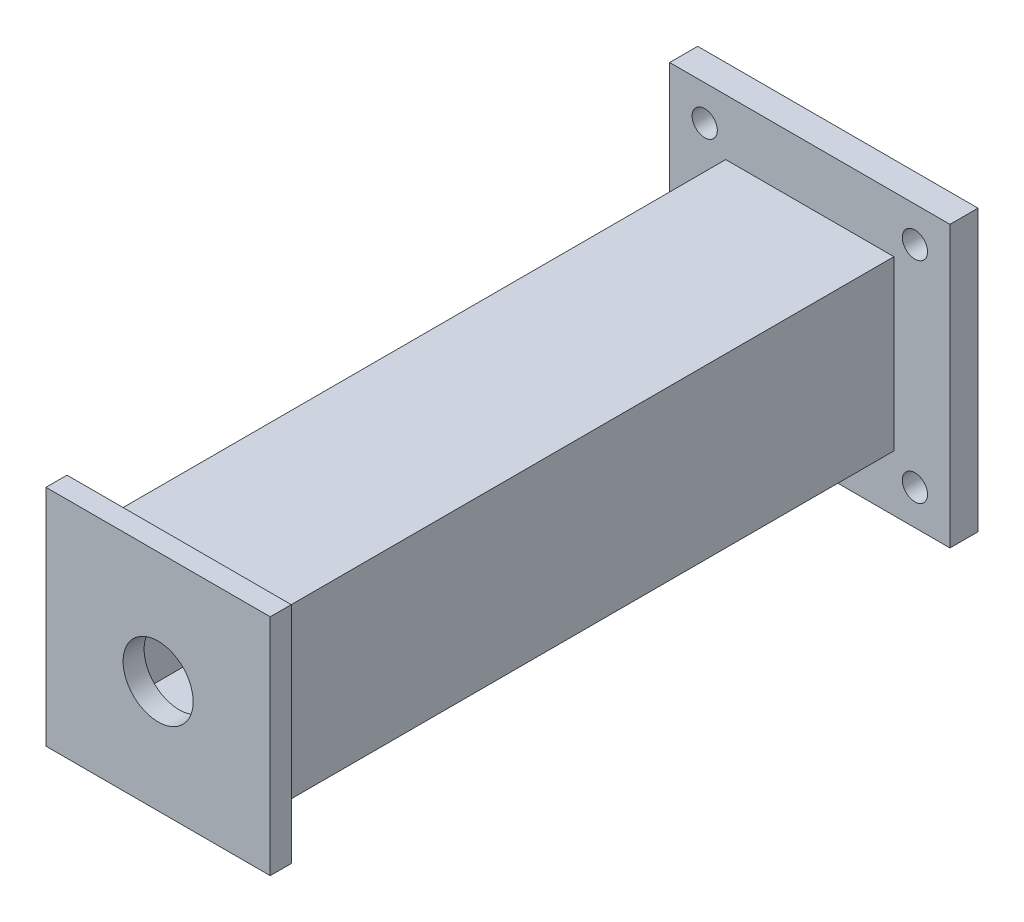
ISO-10303-21;
HEADER;
FILE_DESCRIPTION(('STEP AP214'),'2;1');
FILE_NAME('part.step','',(''),(''),'','','');
FILE_SCHEMA(('AUTOMOTIVE_DESIGN { 1 0 10303 214 1 1 1 1 }'));
ENDSEC;
DATA;
#1=APPLICATION_CONTEXT('core data for automotive mechanical design processes');
#2=APPLICATION_PROTOCOL_DEFINITION('international standard','automotive_design',2000,#1);
#3=PRODUCT_CONTEXT('',#1,'mechanical');
#4=PRODUCT('Part','Part','',(#3));
#5=PRODUCT_RELATED_PRODUCT_CATEGORY('part','',(#4));
#6=PRODUCT_DEFINITION_FORMATION('','',#4);
#7=PRODUCT_DEFINITION_CONTEXT('part definition',#1,'design');
#8=PRODUCT_DEFINITION('design','',#6,#7);
#9=PRODUCT_DEFINITION_SHAPE('','',#8);
#10=(LENGTH_UNIT() NAMED_UNIT(*) SI_UNIT(.MILLI.,.METRE.));
#11=(NAMED_UNIT(*) PLANE_ANGLE_UNIT() SI_UNIT($,.RADIAN.));
#12=(NAMED_UNIT(*) SI_UNIT($,.STERADIAN.) SOLID_ANGLE_UNIT());
#13=UNCERTAINTY_MEASURE_WITH_UNIT(LENGTH_MEASURE(1.E-05),#10,'distance_accuracy_value','');
#14=(GEOMETRIC_REPRESENTATION_CONTEXT(3) GLOBAL_UNCERTAINTY_ASSIGNED_CONTEXT((#13)) GLOBAL_UNIT_ASSIGNED_CONTEXT((#10,
#11,#12)) REPRESENTATION_CONTEXT('',''));
#15=CARTESIAN_POINT('',(0.,0.,0.));
#16=DIRECTION('',(0.,0.,1.));
#17=DIRECTION('',(1.,0.,0.));
#18=AXIS2_PLACEMENT_3D('',#15,#16,#17);
#19=CARTESIAN_POINT('',(-60.,60.,225.));
#20=DIRECTION('',(1.,0.,0.));
#21=DIRECTION('',(0.,0.,-1.));
#22=AXIS2_PLACEMENT_3D('',#19,#20,#21);
#23=PLANE('',#22);
#24=DIRECTION('',(0.,-1.,0.));
#25=VECTOR('',#24,1.);
#26=CARTESIAN_POINT('',(-60.,60.,-225.));
#27=LINE('',#26,#25);
#28=CARTESIAN_POINT('',(-60.,60.,-225.));
#29=VERTEX_POINT('',#28);
#30=CARTESIAN_POINT('',(-60.,-60.,-225.));
#31=VERTEX_POINT('',#30);
#32=EDGE_CURVE('E257',#29,#31,#27,.T.);
#33=ORIENTED_EDGE('',*,*,#32,.T.);
#34=DIRECTION('',(0.,0.,-1.));
#35=VECTOR('',#34,1.);
#36=CARTESIAN_POINT('',(-60.,-60.,225.));
#37=LINE('',#36,#35);
#38=CARTESIAN_POINT('',(-60.,-60.,225.));
#39=VERTEX_POINT('',#38);
#40=EDGE_CURVE('E11',#39,#31,#37,.T.);
#41=ORIENTED_EDGE('',*,*,#40,.F.);
#42=DIRECTION('',(0.,-1.,0.));
#43=VECTOR('',#42,1.);
#44=CARTESIAN_POINT('',(-60.,60.,225.));
#45=LINE('',#44,#43);
#46=CARTESIAN_POINT('',(-60.,60.,225.));
#47=VERTEX_POINT('',#46);
#48=EDGE_CURVE('E258',#47,#39,#45,.T.);
#49=ORIENTED_EDGE('',*,*,#48,.F.);
#50=DIRECTION('',(0.,0.,-1.));
#51=VECTOR('',#50,1.);
#52=CARTESIAN_POINT('',(-60.,60.,225.));
#53=LINE('',#52,#51);
#54=EDGE_CURVE('E271',#47,#29,#53,.T.);
#55=ORIENTED_EDGE('',*,*,#54,.T.);
#56=EDGE_LOOP('',(#33,#41,#49,#55));
#57=FACE_BOUND('',#56,.T.);
#58=ADVANCED_FACE('F39',(#57),#23,.F.);
#59=CARTESIAN_POINT('',(-60.,-60.,225.));
#60=DIRECTION('',(0.,1.,0.));
#61=DIRECTION('',(0.,0.,1.));
#62=AXIS2_PLACEMENT_3D('',#59,#60,#61);
#63=PLANE('',#62);
#64=DIRECTION('',(1.,0.,0.));
#65=VECTOR('',#64,1.);
#66=CARTESIAN_POINT('',(-60.,-60.,-225.));
#67=LINE('',#66,#65);
#68=CARTESIAN_POINT('',(60.,-60.,-225.));
#69=VERTEX_POINT('',#68);
#70=EDGE_CURVE('E274',#31,#69,#67,.T.);
#71=ORIENTED_EDGE('',*,*,#70,.T.);
#72=DIRECTION('',(0.,0.,-1.));
#73=VECTOR('',#72,1.);
#74=CARTESIAN_POINT('',(60.,-60.,225.));
#75=LINE('',#74,#73);
#76=CARTESIAN_POINT('',(60.,-60.,225.));
#77=VERTEX_POINT('',#76);
#78=EDGE_CURVE('E46',#77,#69,#75,.T.);
#79=ORIENTED_EDGE('',*,*,#78,.F.);
#80=DIRECTION('',(1.,0.,0.));
#81=VECTOR('',#80,1.);
#82=CARTESIAN_POINT('',(-60.,-60.,225.));
#83=LINE('',#82,#81);
#84=EDGE_CURVE('E261',#39,#77,#83,.T.);
#85=ORIENTED_EDGE('',*,*,#84,.F.);
#86=ORIENTED_EDGE('',*,*,#40,.T.);
#87=EDGE_LOOP('',(#71,#79,#85,#86));
#88=FACE_BOUND('',#87,.T.);
#89=ADVANCED_FACE('F284',(#88),#63,.F.);
#90=CARTESIAN_POINT('',(60.,60.,225.));
#91=DIRECTION('',(-1.,0.,0.));
#92=DIRECTION('',(0.,0.,1.));
#93=AXIS2_PLACEMENT_3D('',#90,#91,#92);
#94=PLANE('',#93);
#95=DIRECTION('',(0.,1.,0.));
#96=VECTOR('',#95,1.);
#97=CARTESIAN_POINT('',(60.,60.,-225.));
#98=LINE('',#97,#96);
#99=CARTESIAN_POINT('',(60.,60.,-225.));
#100=VERTEX_POINT('',#99);
#101=EDGE_CURVE('E74',#69,#100,#98,.T.);
#102=ORIENTED_EDGE('',*,*,#101,.T.);
#103=DIRECTION('',(0.,0.,-1.));
#104=VECTOR('',#103,1.);
#105=CARTESIAN_POINT('',(60.,60.,225.));
#106=LINE('',#105,#104);
#107=CARTESIAN_POINT('',(60.,60.,225.));
#108=VERTEX_POINT('',#107);
#109=EDGE_CURVE('E62',#108,#100,#106,.T.);
#110=ORIENTED_EDGE('',*,*,#109,.F.);
#111=DIRECTION('',(0.,1.,0.));
#112=VECTOR('',#111,1.);
#113=CARTESIAN_POINT('',(60.,60.,225.));
#114=LINE('',#113,#112);
#115=EDGE_CURVE('E265',#77,#108,#114,.T.);
#116=ORIENTED_EDGE('',*,*,#115,.F.);
#117=ORIENTED_EDGE('',*,*,#78,.T.);
#118=EDGE_LOOP('',(#102,#110,#116,#117));
#119=FACE_BOUND('',#118,.T.);
#120=ADVANCED_FACE('F282',(#119),#94,.F.);
#121=CARTESIAN_POINT('',(-60.,60.,225.));
#122=DIRECTION('',(0.,-1.,0.));
#123=DIRECTION('',(0.,0.,-1.));
#124=AXIS2_PLACEMENT_3D('',#121,#122,#123);
#125=PLANE('',#124);
#126=DIRECTION('',(-1.,0.,0.));
#127=VECTOR('',#126,1.);
#128=CARTESIAN_POINT('',(-60.,60.,-225.));
#129=LINE('',#128,#127);
#130=EDGE_CURVE('E262',#100,#29,#129,.T.);
#131=ORIENTED_EDGE('',*,*,#130,.T.);
#132=ORIENTED_EDGE('',*,*,#54,.F.);
#133=DIRECTION('',(-1.,0.,0.));
#134=VECTOR('',#133,1.);
#135=CARTESIAN_POINT('',(-60.,60.,225.));
#136=LINE('',#135,#134);
#137=EDGE_CURVE('E268',#108,#47,#136,.T.);
#138=ORIENTED_EDGE('',*,*,#137,.F.);
#139=ORIENTED_EDGE('',*,*,#109,.T.);
#140=EDGE_LOOP('',(#131,#132,#138,#139));
#141=FACE_BOUND('',#140,.T.);
#142=ADVANCED_FACE('F291',(#141),#125,.F.);
#143=CARTESIAN_POINT('',(-50.,50.,225.));
#144=DIRECTION('',(1.,0.,0.));
#145=DIRECTION('',(0.,0.,-1.));
#146=AXIS2_PLACEMENT_3D('',#143,#144,#145);
#147=PLANE('',#146);
#148=DIRECTION('',(0.,-1.,0.));
#149=VECTOR('',#148,1.);
#150=CARTESIAN_POINT('',(-50.,50.,-225.));
#151=LINE('',#150,#149);
#152=CARTESIAN_POINT('',(-50.,50.,-225.));
#153=VERTEX_POINT('',#152);
#154=CARTESIAN_POINT('',(-50.,-50.,-225.));
#155=VERTEX_POINT('',#154);
#156=EDGE_CURVE('E228',#153,#155,#151,.T.);
#157=ORIENTED_EDGE('',*,*,#156,.F.);
#158=DIRECTION('',(0.,0.,-1.));
#159=VECTOR('',#158,1.);
#160=CARTESIAN_POINT('',(-50.,50.,225.));
#161=LINE('',#160,#159);
#162=CARTESIAN_POINT('',(-50.,50.,225.));
#163=VERTEX_POINT('',#162);
#164=EDGE_CURVE('E239',#163,#153,#161,.T.);
#165=ORIENTED_EDGE('',*,*,#164,.F.);
#166=DIRECTION('',(0.,-1.,0.));
#167=VECTOR('',#166,1.);
#168=CARTESIAN_POINT('',(-50.,50.,225.));
#169=LINE('',#168,#167);
#170=CARTESIAN_POINT('',(-50.,-50.,225.));
#171=VERTEX_POINT('',#170);
#172=EDGE_CURVE('E229',#163,#171,#169,.T.);
#173=ORIENTED_EDGE('',*,*,#172,.T.);
#174=DIRECTION('',(0.,0.,-1.));
#175=VECTOR('',#174,1.);
#176=CARTESIAN_POINT('',(-50.,-50.,225.));
#177=LINE('',#176,#175);
#178=EDGE_CURVE('E254',#171,#155,#177,.T.);
#179=ORIENTED_EDGE('',*,*,#178,.T.);
#180=EDGE_LOOP('',(#157,#165,#173,#179));
#181=FACE_BOUND('',#180,.T.);
#182=ADVANCED_FACE('F325',(#181),#147,.T.);
#183=CARTESIAN_POINT('',(-50.,-50.,225.));
#184=DIRECTION('',(0.,1.,0.));
#185=DIRECTION('',(0.,0.,1.));
#186=AXIS2_PLACEMENT_3D('',#183,#184,#185);
#187=PLANE('',#186);
#188=DIRECTION('',(1.,0.,0.));
#189=VECTOR('',#188,1.);
#190=CARTESIAN_POINT('',(-50.,-50.,-225.));
#191=LINE('',#190,#189);
#192=CARTESIAN_POINT('',(50.,-50.,-225.));
#193=VERTEX_POINT('',#192);
#194=EDGE_CURVE('E242',#155,#193,#191,.T.);
#195=ORIENTED_EDGE('',*,*,#194,.F.);
#196=ORIENTED_EDGE('',*,*,#178,.F.);
#197=DIRECTION('',(1.,0.,0.));
#198=VECTOR('',#197,1.);
#199=CARTESIAN_POINT('',(-50.,-50.,225.));
#200=LINE('',#199,#198);
#201=CARTESIAN_POINT('',(50.,-50.,225.));
#202=VERTEX_POINT('',#201);
#203=EDGE_CURVE('E232',#171,#202,#200,.T.);
#204=ORIENTED_EDGE('',*,*,#203,.T.);
#205=DIRECTION('',(0.,0.,-1.));
#206=VECTOR('',#205,1.);
#207=CARTESIAN_POINT('',(50.,-50.,225.));
#208=LINE('',#207,#206);
#209=EDGE_CURVE('E252',#202,#193,#208,.T.);
#210=ORIENTED_EDGE('',*,*,#209,.T.);
#211=EDGE_LOOP('',(#195,#196,#204,#210));
#212=FACE_BOUND('',#211,.T.);
#213=ADVANCED_FACE('F328',(#212),#187,.T.);
#214=CARTESIAN_POINT('',(50.,50.,225.));
#215=DIRECTION('',(-1.,0.,0.));
#216=DIRECTION('',(0.,0.,1.));
#217=AXIS2_PLACEMENT_3D('',#214,#215,#216);
#218=PLANE('',#217);
#219=DIRECTION('',(0.,1.,0.));
#220=VECTOR('',#219,1.);
#221=CARTESIAN_POINT('',(50.,50.,-225.));
#222=LINE('',#221,#220);
#223=CARTESIAN_POINT('',(50.,50.,-225.));
#224=VERTEX_POINT('',#223);
#225=EDGE_CURVE('E245',#193,#224,#222,.T.);
#226=ORIENTED_EDGE('',*,*,#225,.F.);
#227=ORIENTED_EDGE('',*,*,#209,.F.);
#228=DIRECTION('',(0.,1.,0.));
#229=VECTOR('',#228,1.);
#230=CARTESIAN_POINT('',(50.,50.,225.));
#231=LINE('',#230,#229);
#232=CARTESIAN_POINT('',(50.,50.,225.));
#233=VERTEX_POINT('',#232);
#234=EDGE_CURVE('E236',#202,#233,#231,.T.);
#235=ORIENTED_EDGE('',*,*,#234,.T.);
#236=DIRECTION('',(0.,0.,-1.));
#237=VECTOR('',#236,1.);
#238=CARTESIAN_POINT('',(50.,50.,225.));
#239=LINE('',#238,#237);
#240=EDGE_CURVE('E83',#233,#224,#239,.T.);
#241=ORIENTED_EDGE('',*,*,#240,.T.);
#242=EDGE_LOOP('',(#226,#227,#235,#241));
#243=FACE_BOUND('',#242,.T.);
#244=ADVANCED_FACE('F306',(#243),#218,.T.);
#245=CARTESIAN_POINT('',(-50.,50.,225.));
#246=DIRECTION('',(0.,-1.,0.));
#247=DIRECTION('',(0.,0.,-1.));
#248=AXIS2_PLACEMENT_3D('',#245,#246,#247);
#249=PLANE('',#248);
#250=DIRECTION('',(-1.,0.,0.));
#251=VECTOR('',#250,1.);
#252=CARTESIAN_POINT('',(-50.,50.,-225.));
#253=LINE('',#252,#251);
#254=EDGE_CURVE('E233',#224,#153,#253,.T.);
#255=ORIENTED_EDGE('',*,*,#254,.F.);
#256=ORIENTED_EDGE('',*,*,#240,.F.);
#257=DIRECTION('',(-1.,0.,0.));
#258=VECTOR('',#257,1.);
#259=CARTESIAN_POINT('',(-50.,50.,225.));
#260=LINE('',#259,#258);
#261=EDGE_CURVE('E53',#233,#163,#260,.T.);
#262=ORIENTED_EDGE('',*,*,#261,.T.);
#263=ORIENTED_EDGE('',*,*,#164,.T.);
#264=EDGE_LOOP('',(#255,#256,#262,#263));
#265=FACE_BOUND('',#264,.T.);
#266=ADVANCED_FACE('F296',(#265),#249,.T.);
#267=CARTESIAN_POINT('',(0.,0.,225.));
#268=DIRECTION('',(0.,0.,1.));
#269=DIRECTION('',(1.,0.,0.));
#270=AXIS2_PLACEMENT_3D('',#267,#268,#269);
#271=PLANE('',#270);
#272=DIRECTION('',(0.,-1.,0.));
#273=VECTOR('',#272,1.);
#274=CARTESIAN_POINT('',(-80.,80.,225.));
#275=LINE('',#274,#273);
#276=CARTESIAN_POINT('',(-80.,80.,225.));
#277=VERTEX_POINT('',#276);
#278=CARTESIAN_POINT('',(-80.,-80.,225.));
#279=VERTEX_POINT('',#278);
#280=EDGE_CURVE('E197',#277,#279,#275,.T.);
#281=ORIENTED_EDGE('',*,*,#280,.F.);
#282=DIRECTION('',(-1.,0.,0.));
#283=VECTOR('',#282,1.);
#284=CARTESIAN_POINT('',(-80.,80.,225.));
#285=LINE('',#284,#283);
#286=CARTESIAN_POINT('',(80.,80.,225.));
#287=VERTEX_POINT('',#286);
#288=EDGE_CURVE('E203',#287,#277,#285,.T.);
#289=ORIENTED_EDGE('',*,*,#288,.F.);
#290=DIRECTION('',(0.,1.,0.));
#291=VECTOR('',#290,1.);
#292=CARTESIAN_POINT('',(80.,80.,225.));
#293=LINE('',#292,#291);
#294=CARTESIAN_POINT('',(80.,-80.,225.));
#295=VERTEX_POINT('',#294);
#296=EDGE_CURVE('E214',#295,#287,#293,.T.);
#297=ORIENTED_EDGE('',*,*,#296,.F.);
#298=DIRECTION('',(1.,0.,0.));
#299=VECTOR('',#298,1.);
#300=CARTESIAN_POINT('',(-80.,-80.,225.));
#301=LINE('',#300,#299);
#302=EDGE_CURVE('E212',#279,#295,#301,.T.);
#303=ORIENTED_EDGE('',*,*,#302,.F.);
#304=EDGE_LOOP('',(#281,#289,#297,#303));
#305=FACE_BOUND('',#304,.T.);
#306=ORIENTED_EDGE('',*,*,#137,.T.);
#307=ORIENTED_EDGE('',*,*,#48,.T.);
#308=ORIENTED_EDGE('',*,*,#84,.T.);
#309=ORIENTED_EDGE('',*,*,#115,.T.);
#310=EDGE_LOOP('',(#306,#307,#308,#309));
#311=FACE_BOUND('',#310,.T.);
#312=ADVANCED_FACE('F293',(#305,#311),#271,.F.);
#313=CARTESIAN_POINT('',(0.,0.,240.));
#314=DIRECTION('',(0.,0.,1.));
#315=DIRECTION('',(1.,0.,0.));
#316=AXIS2_PLACEMENT_3D('',#313,#314,#315);
#317=PLANE('',#316);
#318=DIRECTION('',(0.,-1.,0.));
#319=VECTOR('',#318,1.);
#320=CARTESIAN_POINT('',(-80.,80.,240.));
#321=LINE('',#320,#319);
#322=CARTESIAN_POINT('',(-80.,80.,240.));
#323=VERTEX_POINT('',#322);
#324=CARTESIAN_POINT('',(-80.,-80.,240.));
#325=VERTEX_POINT('',#324);
#326=EDGE_CURVE('E199',#323,#325,#321,.T.);
#327=ORIENTED_EDGE('',*,*,#326,.T.);
#328=DIRECTION('',(1.,0.,0.));
#329=VECTOR('',#328,1.);
#330=CARTESIAN_POINT('',(-80.,-80.,240.));
#331=LINE('',#330,#329);
#332=CARTESIAN_POINT('',(80.,-80.,240.));
#333=VERTEX_POINT('',#332);
#334=EDGE_CURVE('E202',#325,#333,#331,.T.);
#335=ORIENTED_EDGE('',*,*,#334,.T.);
#336=DIRECTION('',(0.,1.,0.));
#337=VECTOR('',#336,1.);
#338=CARTESIAN_POINT('',(80.,80.,240.));
#339=LINE('',#338,#337);
#340=CARTESIAN_POINT('',(80.,80.,240.));
#341=VERTEX_POINT('',#340);
#342=EDGE_CURVE('E205',#333,#341,#339,.T.);
#343=ORIENTED_EDGE('',*,*,#342,.T.);
#344=DIRECTION('',(-1.,0.,0.));
#345=VECTOR('',#344,1.);
#346=CARTESIAN_POINT('',(-80.,80.,240.));
#347=LINE('',#346,#345);
#348=EDGE_CURVE('E207',#341,#323,#347,.T.);
#349=ORIENTED_EDGE('',*,*,#348,.T.);
#350=EDGE_LOOP('',(#327,#335,#343,#349));
#351=FACE_BOUND('',#350,.T.);
#352=CARTESIAN_POINT('',(0.,0.,240.));
#353=DIRECTION('',(0.,0.,1.));
#354=DIRECTION('',(1.,0.,0.));
#355=AXIS2_PLACEMENT_3D('',#352,#353,#354);
#356=CIRCLE('',#355,25.);
#357=CARTESIAN_POINT('',(25.,0.,240.));
#358=VERTEX_POINT('',#357);
#359=EDGE_CURVE('E190',#358,#358,#356,.T.);
#360=ORIENTED_EDGE('',*,*,#359,.F.);
#361=EDGE_LOOP('',(#360));
#362=FACE_BOUND('',#361,.T.);
#363=ADVANCED_FACE('F295',(#351,#362),#317,.T.);
#364=ORIENTED_EDGE('',*,*,#203,.F.);
#365=ORIENTED_EDGE('',*,*,#172,.F.);
#366=ORIENTED_EDGE('',*,*,#261,.F.);
#367=ORIENTED_EDGE('',*,*,#234,.F.);
#368=EDGE_LOOP('',(#364,#365,#366,#367));
#369=FACE_BOUND('',#368,.T.);
#370=CARTESIAN_POINT('',(0.,0.,225.));
#371=DIRECTION('',(0.,0.,1.));
#372=DIRECTION('',(1.,0.,0.));
#373=AXIS2_PLACEMENT_3D('',#370,#371,#372);
#374=CIRCLE('',#373,25.);
#375=CARTESIAN_POINT('',(25.,0.,225.));
#376=VERTEX_POINT('',#375);
#377=EDGE_CURVE('E187',#376,#376,#374,.T.);
#378=ORIENTED_EDGE('',*,*,#377,.T.);
#379=EDGE_LOOP('',(#378));
#380=FACE_BOUND('',#379,.T.);
#381=ADVANCED_FACE('F299',(#369,#380),#271,.F.);
#382=CARTESIAN_POINT('',(-80.,80.,240.));
#383=DIRECTION('',(1.,0.,0.));
#384=DIRECTION('',(0.,0.,-1.));
#385=AXIS2_PLACEMENT_3D('',#382,#383,#384);
#386=PLANE('',#385);
#387=ORIENTED_EDGE('',*,*,#280,.T.);
#388=DIRECTION('',(0.,0.,-1.));
#389=VECTOR('',#388,1.);
#390=CARTESIAN_POINT('',(-80.,-80.,240.));
#391=LINE('',#390,#389);
#392=EDGE_CURVE('E225',#325,#279,#391,.T.);
#393=ORIENTED_EDGE('',*,*,#392,.F.);
#394=ORIENTED_EDGE('',*,*,#326,.F.);
#395=DIRECTION('',(0.,0.,-1.));
#396=VECTOR('',#395,1.);
#397=CARTESIAN_POINT('',(-80.,80.,240.));
#398=LINE('',#397,#396);
#399=EDGE_CURVE('E209',#323,#277,#398,.T.);
#400=ORIENTED_EDGE('',*,*,#399,.T.);
#401=EDGE_LOOP('',(#387,#393,#394,#400));
#402=FACE_BOUND('',#401,.T.);
#403=ADVANCED_FACE('F312',(#402),#386,.F.);
#404=CARTESIAN_POINT('',(-80.,-80.,240.));
#405=DIRECTION('',(0.,1.,0.));
#406=DIRECTION('',(0.,0.,1.));
#407=AXIS2_PLACEMENT_3D('',#404,#405,#406);
#408=PLANE('',#407);
#409=ORIENTED_EDGE('',*,*,#302,.T.);
#410=DIRECTION('',(0.,0.,-1.));
#411=VECTOR('',#410,1.);
#412=CARTESIAN_POINT('',(80.,-80.,240.));
#413=LINE('',#412,#411);
#414=EDGE_CURVE('E222',#333,#295,#413,.T.);
#415=ORIENTED_EDGE('',*,*,#414,.F.);
#416=ORIENTED_EDGE('',*,*,#334,.F.);
#417=ORIENTED_EDGE('',*,*,#392,.T.);
#418=EDGE_LOOP('',(#409,#415,#416,#417));
#419=FACE_BOUND('',#418,.T.);
#420=ADVANCED_FACE('F337',(#419),#408,.F.);
#421=CARTESIAN_POINT('',(80.,80.,240.));
#422=DIRECTION('',(-1.,0.,0.));
#423=DIRECTION('',(0.,0.,1.));
#424=AXIS2_PLACEMENT_3D('',#421,#422,#423);
#425=PLANE('',#424);
#426=ORIENTED_EDGE('',*,*,#296,.T.);
#427=DIRECTION('',(0.,0.,-1.));
#428=VECTOR('',#427,1.);
#429=CARTESIAN_POINT('',(80.,80.,240.));
#430=LINE('',#429,#428);
#431=EDGE_CURVE('E219',#341,#287,#430,.T.);
#432=ORIENTED_EDGE('',*,*,#431,.F.);
#433=ORIENTED_EDGE('',*,*,#342,.F.);
#434=ORIENTED_EDGE('',*,*,#414,.T.);
#435=EDGE_LOOP('',(#426,#432,#433,#434));
#436=FACE_BOUND('',#435,.T.);
#437=ADVANCED_FACE('F341',(#436),#425,.F.);
#438=CARTESIAN_POINT('',(-80.,80.,240.));
#439=DIRECTION('',(0.,-1.,0.));
#440=DIRECTION('',(0.,0.,-1.));
#441=AXIS2_PLACEMENT_3D('',#438,#439,#440);
#442=PLANE('',#441);
#443=ORIENTED_EDGE('',*,*,#288,.T.);
#444=ORIENTED_EDGE('',*,*,#399,.F.);
#445=ORIENTED_EDGE('',*,*,#348,.F.);
#446=ORIENTED_EDGE('',*,*,#431,.T.);
#447=EDGE_LOOP('',(#443,#444,#445,#446));
#448=FACE_BOUND('',#447,.T.);
#449=ADVANCED_FACE('F344',(#448),#442,.F.);
#450=CARTESIAN_POINT('',(0.,0.,240.));
#451=DIRECTION('',(0.,0.,-1.));
#452=DIRECTION('',(-1.,0.,0.));
#453=AXIS2_PLACEMENT_3D('',#450,#451,#452);
#454=CYLINDRICAL_SURFACE('',#453,25.);
#455=ORIENTED_EDGE('',*,*,#359,.T.);
#456=EDGE_LOOP('',(#455));
#457=FACE_BOUND('',#456,.T.);
#458=ORIENTED_EDGE('',*,*,#377,.F.);
#459=EDGE_LOOP('',(#458));
#460=FACE_BOUND('',#459,.T.);
#461=ADVANCED_FACE('F347',(#457,#460),#454,.F.);
#462=CARTESIAN_POINT('',(0.,0.,-225.));
#463=DIRECTION('',(0.,0.,-1.));
#464=DIRECTION('',(-1.,0.,0.));
#465=AXIS2_PLACEMENT_3D('',#462,#463,#464);
#466=PLANE('',#465);
#467=ORIENTED_EDGE('',*,*,#254,.T.);
#468=ORIENTED_EDGE('',*,*,#156,.T.);
#469=ORIENTED_EDGE('',*,*,#194,.T.);
#470=ORIENTED_EDGE('',*,*,#225,.T.);
#471=EDGE_LOOP('',(#467,#468,#469,#470));
#472=FACE_BOUND('',#471,.T.);
#473=ADVANCED_FACE('F351',(#472),#466,.F.);
#474=CARTESIAN_POINT('',(0.,0.,-245.));
#475=DIRECTION('',(0.,0.,-1.));
#476=DIRECTION('',(-1.,0.,0.));
#477=AXIS2_PLACEMENT_3D('',#474,#475,#476);
#478=PLANE('',#477);
#479=CARTESIAN_POINT('',(-75.,-75.,-245.));
#480=DIRECTION('',(0.,0.,-1.));
#481=DIRECTION('',(-1.,0.,0.));
#482=AXIS2_PLACEMENT_3D('',#479,#480,#481);
#483=CIRCLE('',#482,8.99999999999999);
#484=CARTESIAN_POINT('',(-84.,-75.,-245.));
#485=VERTEX_POINT('',#484);
#486=EDGE_CURVE('E419',#485,#485,#483,.T.);
#487=ORIENTED_EDGE('',*,*,#486,.F.);
#488=EDGE_LOOP('',(#487));
#489=FACE_BOUND('',#488,.T.);
#490=CARTESIAN_POINT('',(-75.,75.,-245.));
#491=DIRECTION('',(0.,0.,-1.));
#492=DIRECTION('',(-1.,0.,0.));
#493=AXIS2_PLACEMENT_3D('',#490,#491,#492);
#494=CIRCLE('',#493,8.99999999999999);
#495=CARTESIAN_POINT('',(-84.,75.,-245.));
#496=VERTEX_POINT('',#495);
#497=EDGE_CURVE('E431',#496,#496,#494,.T.);
#498=ORIENTED_EDGE('',*,*,#497,.F.);
#499=EDGE_LOOP('',(#498));
#500=FACE_BOUND('',#499,.T.);
#501=DIRECTION('',(0.,-1.,0.));
#502=VECTOR('',#501,1.);
#503=CARTESIAN_POINT('',(100.,100.,-245.));
#504=LINE('',#503,#502);
#505=CARTESIAN_POINT('',(100.,100.,-245.));
#506=VERTEX_POINT('',#505);
#507=CARTESIAN_POINT('',(100.,-100.,-245.));
#508=VERTEX_POINT('',#507);
#509=EDGE_CURVE('E172',#506,#508,#504,.T.);
#510=ORIENTED_EDGE('',*,*,#509,.T.);
#511=DIRECTION('',(-1.,0.,0.));
#512=VECTOR('',#511,1.);
#513=CARTESIAN_POINT('',(100.,-100.,-245.));
#514=LINE('',#513,#512);
#515=CARTESIAN_POINT('',(-100.,-100.,-245.));
#516=VERTEX_POINT('',#515);
#517=EDGE_CURVE('E161',#508,#516,#514,.T.);
#518=ORIENTED_EDGE('',*,*,#517,.T.);
#519=DIRECTION('',(0.,1.,0.));
#520=VECTOR('',#519,1.);
#521=CARTESIAN_POINT('',(-100.,100.,-245.));
#522=LINE('',#521,#520);
#523=CARTESIAN_POINT('',(-100.,100.,-245.));
#524=VERTEX_POINT('',#523);
#525=EDGE_CURVE('E171',#516,#524,#522,.T.);
#526=ORIENTED_EDGE('',*,*,#525,.T.);
#527=DIRECTION('',(1.,0.,0.));
#528=VECTOR('',#527,1.);
#529=CARTESIAN_POINT('',(100.,100.,-245.));
#530=LINE('',#529,#528);
#531=EDGE_CURVE('E178',#524,#506,#530,.T.);
#532=ORIENTED_EDGE('',*,*,#531,.T.);
#533=EDGE_LOOP('',(#510,#518,#526,#532));
#534=FACE_BOUND('',#533,.T.);
#535=CARTESIAN_POINT('',(75.,75.,-245.));
#536=DIRECTION('',(0.,0.,-1.));
#537=DIRECTION('',(-1.,0.,0.));
#538=AXIS2_PLACEMENT_3D('',#535,#536,#537);
#539=CIRCLE('',#538,8.99999999999999);
#540=CARTESIAN_POINT('',(66.,75.,-245.));
#541=VERTEX_POINT('',#540);
#542=EDGE_CURVE('E425',#541,#541,#539,.T.);
#543=ORIENTED_EDGE('',*,*,#542,.F.);
#544=EDGE_LOOP('',(#543));
#545=FACE_BOUND('',#544,.T.);
#546=CARTESIAN_POINT('',(75.,-75.,-245.));
#547=DIRECTION('',(0.,0.,-1.));
#548=DIRECTION('',(-1.,0.,0.));
#549=AXIS2_PLACEMENT_3D('',#546,#547,#548);
#550=CIRCLE('',#549,8.99999999999999);
#551=CARTESIAN_POINT('',(66.,-75.,-245.));
#552=VERTEX_POINT('',#551);
#553=EDGE_CURVE('E410',#552,#552,#550,.T.);
#554=ORIENTED_EDGE('',*,*,#553,.F.);
#555=EDGE_LOOP('',(#554));
#556=FACE_BOUND('',#555,.T.);
#557=ADVANCED_FACE('F175',(#489,#500,#534,#545,#556),#478,.T.);
#558=ORIENTED_EDGE('',*,*,#32,.F.);
#559=ORIENTED_EDGE('',*,*,#130,.F.);
#560=ORIENTED_EDGE('',*,*,#101,.F.);
#561=ORIENTED_EDGE('',*,*,#70,.F.);
#562=EDGE_LOOP('',(#558,#559,#560,#561));
#563=FACE_BOUND('',#562,.T.);
#564=DIRECTION('',(0.,-1.,0.));
#565=VECTOR('',#564,1.);
#566=CARTESIAN_POINT('',(100.,100.,-225.));
#567=LINE('',#566,#565);
#568=CARTESIAN_POINT('',(100.,100.,-225.));
#569=VERTEX_POINT('',#568);
#570=CARTESIAN_POINT('',(100.,-100.,-225.));
#571=VERTEX_POINT('',#570);
#572=EDGE_CURVE('E186',#569,#571,#567,.T.);
#573=ORIENTED_EDGE('',*,*,#572,.F.);
#574=DIRECTION('',(1.,0.,0.));
#575=VECTOR('',#574,1.);
#576=CARTESIAN_POINT('',(100.,100.,-225.));
#577=LINE('',#576,#575);
#578=CARTESIAN_POINT('',(-100.,100.,-225.));
#579=VERTEX_POINT('',#578);
#580=EDGE_CURVE('E182',#579,#569,#577,.T.);
#581=ORIENTED_EDGE('',*,*,#580,.F.);
#582=DIRECTION('',(0.,1.,0.));
#583=VECTOR('',#582,1.);
#584=CARTESIAN_POINT('',(-100.,100.,-225.));
#585=LINE('',#584,#583);
#586=CARTESIAN_POINT('',(-100.,-100.,-225.));
#587=VERTEX_POINT('',#586);
#588=EDGE_CURVE('E442',#587,#579,#585,.T.);
#589=ORIENTED_EDGE('',*,*,#588,.F.);
#590=DIRECTION('',(-1.,0.,0.));
#591=VECTOR('',#590,1.);
#592=CARTESIAN_POINT('',(100.,-100.,-225.));
#593=LINE('',#592,#591);
#594=EDGE_CURVE('E440',#571,#587,#593,.T.);
#595=ORIENTED_EDGE('',*,*,#594,.F.);
#596=EDGE_LOOP('',(#573,#581,#589,#595));
#597=FACE_BOUND('',#596,.T.);
#598=CARTESIAN_POINT('',(-75.,75.,-225.));
#599=DIRECTION('',(0.,0.,-1.));
#600=DIRECTION('',(-1.,0.,0.));
#601=AXIS2_PLACEMENT_3D('',#598,#599,#600);
#602=CIRCLE('',#601,8.99999999999999);
#603=CARTESIAN_POINT('',(-84.,75.,-225.));
#604=VERTEX_POINT('',#603);
#605=EDGE_CURVE('E428',#604,#604,#602,.T.);
#606=ORIENTED_EDGE('',*,*,#605,.T.);
#607=EDGE_LOOP('',(#606));
#608=FACE_BOUND('',#607,.T.);
#609=CARTESIAN_POINT('',(75.,75.,-225.));
#610=DIRECTION('',(0.,0.,-1.));
#611=DIRECTION('',(-1.,0.,0.));
#612=AXIS2_PLACEMENT_3D('',#609,#610,#611);
#613=CIRCLE('',#612,8.99999999999999);
#614=CARTESIAN_POINT('',(66.,75.,-225.));
#615=VERTEX_POINT('',#614);
#616=EDGE_CURVE('E422',#615,#615,#613,.T.);
#617=ORIENTED_EDGE('',*,*,#616,.T.);
#618=EDGE_LOOP('',(#617));
#619=FACE_BOUND('',#618,.T.);
#620=CARTESIAN_POINT('',(-75.,-75.,-225.));
#621=DIRECTION('',(0.,0.,-1.));
#622=DIRECTION('',(-1.,0.,0.));
#623=AXIS2_PLACEMENT_3D('',#620,#621,#622);
#624=CIRCLE('',#623,8.99999999999999);
#625=CARTESIAN_POINT('',(-84.,-75.,-225.));
#626=VERTEX_POINT('',#625);
#627=EDGE_CURVE('E416',#626,#626,#624,.T.);
#628=ORIENTED_EDGE('',*,*,#627,.T.);
#629=EDGE_LOOP('',(#628));
#630=FACE_BOUND('',#629,.T.);
#631=CARTESIAN_POINT('',(75.,-75.,-225.));
#632=DIRECTION('',(0.,0.,-1.));
#633=DIRECTION('',(-1.,0.,0.));
#634=AXIS2_PLACEMENT_3D('',#631,#632,#633);
#635=CIRCLE('',#634,8.99999999999999);
#636=CARTESIAN_POINT('',(66.,-75.,-225.));
#637=VERTEX_POINT('',#636);
#638=EDGE_CURVE('E413',#637,#637,#635,.T.);
#639=ORIENTED_EDGE('',*,*,#638,.T.);
#640=EDGE_LOOP('',(#639));
#641=FACE_BOUND('',#640,.T.);
#642=ADVANCED_FACE('F286',(#563,#597,#608,#619,#630,#641),#466,.F.);
#643=CARTESIAN_POINT('',(100.,100.,-245.));
#644=DIRECTION('',(-1.,0.,0.));
#645=DIRECTION('',(0.,0.,1.));
#646=AXIS2_PLACEMENT_3D('',#643,#644,#645);
#647=PLANE('',#646);
#648=ORIENTED_EDGE('',*,*,#572,.T.);
#649=DIRECTION('',(0.,0.,1.));
#650=VECTOR('',#649,1.);
#651=CARTESIAN_POINT('',(100.,-100.,-245.));
#652=LINE('',#651,#650);
#653=EDGE_CURVE('E165',#508,#571,#652,.T.);
#654=ORIENTED_EDGE('',*,*,#653,.F.);
#655=ORIENTED_EDGE('',*,*,#509,.F.);
#656=DIRECTION('',(0.,0.,1.));
#657=VECTOR('',#656,1.);
#658=CARTESIAN_POINT('',(100.,100.,-245.));
#659=LINE('',#658,#657);
#660=EDGE_CURVE('E438',#506,#569,#659,.T.);
#661=ORIENTED_EDGE('',*,*,#660,.T.);
#662=EDGE_LOOP('',(#648,#654,#655,#661));
#663=FACE_BOUND('',#662,.T.);
#664=ADVANCED_FACE('F184',(#663),#647,.F.);
#665=CARTESIAN_POINT('',(100.,-100.,-245.));
#666=DIRECTION('',(0.,1.,0.));
#667=DIRECTION('',(0.,0.,1.));
#668=AXIS2_PLACEMENT_3D('',#665,#666,#667);
#669=PLANE('',#668);
#670=ORIENTED_EDGE('',*,*,#594,.T.);
#671=DIRECTION('',(0.,0.,1.));
#672=VECTOR('',#671,1.);
#673=CARTESIAN_POINT('',(-100.,-100.,-245.));
#674=LINE('',#673,#672);
#675=EDGE_CURVE('E168',#516,#587,#674,.T.);
#676=ORIENTED_EDGE('',*,*,#675,.F.);
#677=ORIENTED_EDGE('',*,*,#517,.F.);
#678=ORIENTED_EDGE('',*,*,#653,.T.);
#679=EDGE_LOOP('',(#670,#676,#677,#678));
#680=FACE_BOUND('',#679,.T.);
#681=ADVANCED_FACE('F163',(#680),#669,.F.);
#682=CARTESIAN_POINT('',(-100.,100.,-245.));
#683=DIRECTION('',(1.,0.,0.));
#684=DIRECTION('',(0.,0.,-1.));
#685=AXIS2_PLACEMENT_3D('',#682,#683,#684);
#686=PLANE('',#685);
#687=ORIENTED_EDGE('',*,*,#588,.T.);
#688=DIRECTION('',(0.,0.,1.));
#689=VECTOR('',#688,1.);
#690=CARTESIAN_POINT('',(-100.,100.,-245.));
#691=LINE('',#690,#689);
#692=EDGE_CURVE('E192',#524,#579,#691,.T.);
#693=ORIENTED_EDGE('',*,*,#692,.F.);
#694=ORIENTED_EDGE('',*,*,#525,.F.);
#695=ORIENTED_EDGE('',*,*,#675,.T.);
#696=EDGE_LOOP('',(#687,#693,#694,#695));
#697=FACE_BOUND('',#696,.T.);
#698=ADVANCED_FACE('F378',(#697),#686,.F.);
#699=CARTESIAN_POINT('',(100.,100.,-245.));
#700=DIRECTION('',(0.,-1.,0.));
#701=DIRECTION('',(0.,0.,-1.));
#702=AXIS2_PLACEMENT_3D('',#699,#700,#701);
#703=PLANE('',#702);
#704=ORIENTED_EDGE('',*,*,#580,.T.);
#705=ORIENTED_EDGE('',*,*,#660,.F.);
#706=ORIENTED_EDGE('',*,*,#531,.F.);
#707=ORIENTED_EDGE('',*,*,#692,.T.);
#708=EDGE_LOOP('',(#704,#705,#706,#707));
#709=FACE_BOUND('',#708,.T.);
#710=ADVANCED_FACE('F381',(#709),#703,.F.);
#711=CARTESIAN_POINT('',(-75.,75.,-245.));
#712=DIRECTION('',(0.,0.,1.));
#713=DIRECTION('',(1.,0.,0.));
#714=AXIS2_PLACEMENT_3D('',#711,#712,#713);
#715=CYLINDRICAL_SURFACE('',#714,8.99999999999999);
#716=ORIENTED_EDGE('',*,*,#497,.T.);
#717=EDGE_LOOP('',(#716));
#718=FACE_BOUND('',#717,.T.);
#719=ORIENTED_EDGE('',*,*,#605,.F.);
#720=EDGE_LOOP('',(#719));
#721=FACE_BOUND('',#720,.T.);
#722=ADVANCED_FACE('F384',(#718,#721),#715,.F.);
#723=CARTESIAN_POINT('',(75.,75.,-245.));
#724=DIRECTION('',(0.,0.,1.));
#725=DIRECTION('',(1.,0.,0.));
#726=AXIS2_PLACEMENT_3D('',#723,#724,#725);
#727=CYLINDRICAL_SURFACE('',#726,8.99999999999999);
#728=ORIENTED_EDGE('',*,*,#542,.T.);
#729=EDGE_LOOP('',(#728));
#730=FACE_BOUND('',#729,.T.);
#731=ORIENTED_EDGE('',*,*,#616,.F.);
#732=EDGE_LOOP('',(#731));
#733=FACE_BOUND('',#732,.T.);
#734=ADVANCED_FACE('F393',(#730,#733),#727,.F.);
#735=CARTESIAN_POINT('',(-75.,-75.,-245.));
#736=DIRECTION('',(0.,0.,1.));
#737=DIRECTION('',(1.,0.,0.));
#738=AXIS2_PLACEMENT_3D('',#735,#736,#737);
#739=CYLINDRICAL_SURFACE('',#738,8.99999999999999);
#740=ORIENTED_EDGE('',*,*,#486,.T.);
#741=EDGE_LOOP('',(#740));
#742=FACE_BOUND('',#741,.T.);
#743=ORIENTED_EDGE('',*,*,#627,.F.);
#744=EDGE_LOOP('',(#743));
#745=FACE_BOUND('',#744,.T.);
#746=ADVANCED_FACE('F397',(#742,#745),#739,.F.);
#747=CARTESIAN_POINT('',(75.,-75.,-245.));
#748=DIRECTION('',(0.,0.,1.));
#749=DIRECTION('',(1.,0.,0.));
#750=AXIS2_PLACEMENT_3D('',#747,#748,#749);
#751=CYLINDRICAL_SURFACE('',#750,8.99999999999999);
#752=ORIENTED_EDGE('',*,*,#553,.T.);
#753=EDGE_LOOP('',(#752));
#754=FACE_BOUND('',#753,.T.);
#755=ORIENTED_EDGE('',*,*,#638,.F.);
#756=EDGE_LOOP('',(#755));
#757=FACE_BOUND('',#756,.T.);
#758=ADVANCED_FACE('F401',(#754,#757),#751,.F.);
#759=CLOSED_SHELL('',(#58,#89,#120,#142,#182,#213,#244,#266,#312,#363,#381,#403,#420,#437,#449,
#461,#473,#557,#642,#664,#681,#698,#710,#722,#734,#746,#758));
#760=MANIFOLD_SOLID_BREP('B2',#759);
#761=ADVANCED_BREP_SHAPE_REPRESENTATION('',(#18,#760),#14);
#762=SHAPE_DEFINITION_REPRESENTATION(#9,#761);
ENDSEC;
END-ISO-10303-21;
